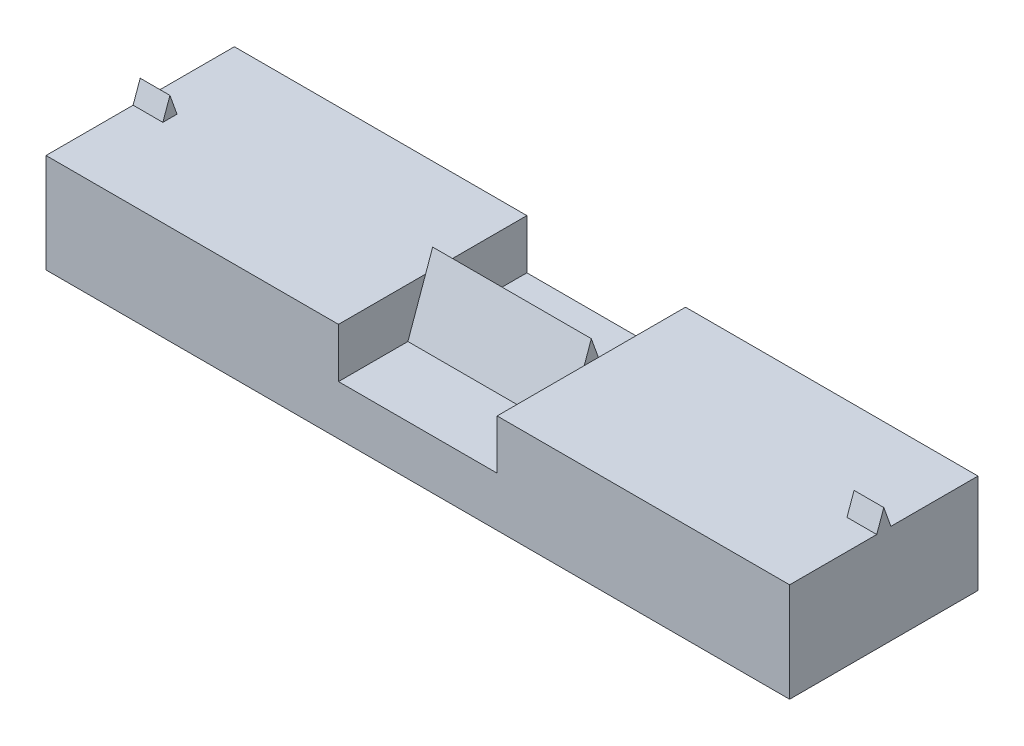
ISO-10303-21;
HEADER;
FILE_DESCRIPTION(('STEP AP214'),'2;1');
FILE_NAME('part.step','',(''),(''),'','','');
FILE_SCHEMA(('AUTOMOTIVE_DESIGN { 1 0 10303 214 1 1 1 1 }'));
ENDSEC;
DATA;
#1=APPLICATION_CONTEXT('core data for automotive mechanical design processes');
#2=APPLICATION_PROTOCOL_DEFINITION('international standard','automotive_design',2000,#1);
#3=PRODUCT_CONTEXT('',#1,'mechanical');
#4=PRODUCT('Part','Part','',(#3));
#5=PRODUCT_RELATED_PRODUCT_CATEGORY('part','',(#4));
#6=PRODUCT_DEFINITION_FORMATION('','',#4);
#7=PRODUCT_DEFINITION_CONTEXT('part definition',#1,'design');
#8=PRODUCT_DEFINITION('design','',#6,#7);
#9=PRODUCT_DEFINITION_SHAPE('','',#8);
#10=(LENGTH_UNIT() NAMED_UNIT(*) SI_UNIT(.MILLI.,.METRE.));
#11=(NAMED_UNIT(*) PLANE_ANGLE_UNIT() SI_UNIT($,.RADIAN.));
#12=(NAMED_UNIT(*) SI_UNIT($,.STERADIAN.) SOLID_ANGLE_UNIT());
#13=UNCERTAINTY_MEASURE_WITH_UNIT(LENGTH_MEASURE(1.E-05),#10,'distance_accuracy_value','');
#14=(GEOMETRIC_REPRESENTATION_CONTEXT(3) GLOBAL_UNCERTAINTY_ASSIGNED_CONTEXT((#13)) GLOBAL_UNIT_ASSIGNED_CONTEXT((#10,
#11,#12)) REPRESENTATION_CONTEXT('',''));
#15=CARTESIAN_POINT('',(0.,0.,0.));
#16=DIRECTION('',(0.,0.,1.));
#17=DIRECTION('',(1.,0.,0.));
#18=AXIS2_PLACEMENT_3D('',#15,#16,#17);
#19=CARTESIAN_POINT('',(37.5,-5.,-2.5));
#20=DIRECTION('',(0.,0.336336396998156,-0.941741911594837));
#21=DIRECTION('',(0.,0.941741911594837,0.336336396998156));
#22=AXIS2_PLACEMENT_3D('',#19,#20,#21);
#23=PLANE('',#22);
#24=DIRECTION('',(-1.,0.,0.));
#25=VECTOR('',#24,1.);
#26=CARTESIAN_POINT('',(37.5,2.,0.));
#27=LINE('',#26,#25);
#28=CARTESIAN_POINT('',(-34.5,2.,0.));
#29=VERTEX_POINT('',#28);
#30=CARTESIAN_POINT('',(-37.5,2.,0.));
#31=VERTEX_POINT('',#30);
#32=EDGE_CURVE('E315',#29,#31,#27,.T.);
#33=ORIENTED_EDGE('',*,*,#32,.F.);
#34=DIRECTION('',(0.,-0.941741911594837,-0.336336396998156));
#35=VECTOR('',#34,1.);
#36=CARTESIAN_POINT('',(-34.5,-5.,-2.5));
#37=LINE('',#36,#35);
#38=CARTESIAN_POINT('',(-34.5,0.,-0.714285714285714));
#39=VERTEX_POINT('',#38);
#40=EDGE_CURVE('E327',#29,#39,#37,.T.);
#41=ORIENTED_EDGE('',*,*,#40,.T.);
#42=DIRECTION('',(1.,0.,0.));
#43=VECTOR('',#42,1.);
#44=CARTESIAN_POINT('',(0.,0.,-0.714285714285713));
#45=LINE('',#44,#43);
#46=CARTESIAN_POINT('',(-37.5,0.,-0.714285714285714));
#47=VERTEX_POINT('',#46);
#48=EDGE_CURVE('E197',#47,#39,#45,.T.);
#49=ORIENTED_EDGE('',*,*,#48,.F.);
#50=DIRECTION('',(0.,-0.941741911594837,-0.336336396998156));
#51=VECTOR('',#50,1.);
#52=CARTESIAN_POINT('',(-37.5,-5.,-2.5));
#53=LINE('',#52,#51);
#54=EDGE_CURVE('E321',#31,#47,#53,.T.);
#55=ORIENTED_EDGE('',*,*,#54,.F.);
#56=EDGE_LOOP('',(#33,#41,#49,#55));
#57=FACE_BOUND('',#56,.T.);
#58=ADVANCED_FACE('F32',(#57),#23,.T.);
#59=DIRECTION('',(0.,-0.941741911594837,-0.336336396998156));
#60=VECTOR('',#59,1.);
#61=CARTESIAN_POINT('',(-8.,-1.19909502262443,-1.14253393665158));
#62=LINE('',#61,#60);
#63=CARTESIAN_POINT('',(-8.,0.,-0.714285714285714));
#64=VERTEX_POINT('',#63);
#65=CARTESIAN_POINT('',(-8.,-5.,-2.5));
#66=VERTEX_POINT('',#65);
#67=EDGE_CURVE('E303',#64,#66,#62,.T.);
#68=ORIENTED_EDGE('',*,*,#67,.F.);
#69=DIRECTION('',(0.,0.941741911594837,0.336336396998156));
#70=VECTOR('',#69,1.);
#71=CARTESIAN_POINT('',(-8.,-5.,-2.5));
#72=LINE('',#71,#70);
#73=CARTESIAN_POINT('',(-8.,2.,0.));
#74=VERTEX_POINT('',#73);
#75=EDGE_CURVE('E185',#64,#74,#72,.T.);
#76=ORIENTED_EDGE('',*,*,#75,.T.);
#77=CARTESIAN_POINT('',(8.,2.,0.));
#78=VERTEX_POINT('',#77);
#79=EDGE_CURVE('E184',#78,#74,#27,.T.);
#80=ORIENTED_EDGE('',*,*,#79,.F.);
#81=DIRECTION('',(0.,-0.941741911594837,-0.336336396998156));
#82=VECTOR('',#81,1.);
#83=CARTESIAN_POINT('',(8.,-5.,-2.5));
#84=LINE('',#83,#82);
#85=CARTESIAN_POINT('',(8.,0.,-0.714285714285714));
#86=VERTEX_POINT('',#85);
#87=EDGE_CURVE('E166',#78,#86,#84,.T.);
#88=ORIENTED_EDGE('',*,*,#87,.T.);
#89=DIRECTION('',(0.,0.941741911594837,0.336336396998156));
#90=VECTOR('',#89,1.);
#91=CARTESIAN_POINT('',(8.,-1.19909502262443,-1.14253393665158));
#92=LINE('',#91,#90);
#93=CARTESIAN_POINT('',(8.,-5.,-2.5));
#94=VERTEX_POINT('',#93);
#95=EDGE_CURVE('E180',#94,#86,#92,.T.);
#96=ORIENTED_EDGE('',*,*,#95,.F.);
#97=DIRECTION('',(1.,0.,0.));
#98=VECTOR('',#97,1.);
#99=CARTESIAN_POINT('',(0.,-5.,-2.5));
#100=LINE('',#99,#98);
#101=EDGE_CURVE('E262',#66,#94,#100,.T.);
#102=ORIENTED_EDGE('',*,*,#101,.F.);
#103=EDGE_LOOP('',(#68,#76,#80,#88,#96,#102));
#104=FACE_BOUND('',#103,.T.);
#105=ADVANCED_FACE('F179',(#104),#23,.T.);
#106=DIRECTION('',(1.,0.,0.));
#107=VECTOR('',#106,1.);
#108=CARTESIAN_POINT('',(0.,0.,-0.714285714285713));
#109=LINE('',#108,#107);
#110=CARTESIAN_POINT('',(34.5,0.,-0.714285714285714));
#111=VERTEX_POINT('',#110);
#112=CARTESIAN_POINT('',(37.5,0.,-0.714285714285714));
#113=VERTEX_POINT('',#112);
#114=EDGE_CURVE('E196',#111,#113,#109,.T.);
#115=ORIENTED_EDGE('',*,*,#114,.F.);
#116=DIRECTION('',(0.,0.941741911594837,0.336336396998156));
#117=VECTOR('',#116,1.);
#118=CARTESIAN_POINT('',(34.5,-5.,-2.5));
#119=LINE('',#118,#117);
#120=CARTESIAN_POINT('',(34.5,2.,0.));
#121=VERTEX_POINT('',#120);
#122=EDGE_CURVE('E186',#111,#121,#119,.T.);
#123=ORIENTED_EDGE('',*,*,#122,.T.);
#124=CARTESIAN_POINT('',(37.5,2.,0.));
#125=VERTEX_POINT('',#124);
#126=EDGE_CURVE('E277',#125,#121,#27,.T.);
#127=ORIENTED_EDGE('',*,*,#126,.F.);
#128=DIRECTION('',(0.,-0.941741911594837,-0.336336396998156));
#129=VECTOR('',#128,1.);
#130=CARTESIAN_POINT('',(37.5,-5.,-2.5));
#131=LINE('',#130,#129);
#132=EDGE_CURVE('E316',#125,#113,#131,.T.);
#133=ORIENTED_EDGE('',*,*,#132,.T.);
#134=EDGE_LOOP('',(#115,#123,#127,#133));
#135=FACE_BOUND('',#134,.T.);
#136=ADVANCED_FACE('F339',(#135),#23,.T.);
#137=CARTESIAN_POINT('',(37.5,2.,0.));
#138=DIRECTION('',(0.,0.336336396998156,0.941741911594837));
#139=DIRECTION('',(0.,-0.941741911594837,0.336336396998156));
#140=AXIS2_PLACEMENT_3D('',#137,#138,#139);
#141=PLANE('',#140);
#142=DIRECTION('',(-1.,0.,0.));
#143=VECTOR('',#142,1.);
#144=CARTESIAN_POINT('',(0.,0.,0.714285714285714));
#145=LINE('',#144,#143);
#146=CARTESIAN_POINT('',(-34.5,0.,0.714285714285714));
#147=VERTEX_POINT('',#146);
#148=CARTESIAN_POINT('',(-37.5,0.,0.714285714285714));
#149=VERTEX_POINT('',#148);
#150=EDGE_CURVE('E276',#147,#149,#145,.T.);
#151=ORIENTED_EDGE('',*,*,#150,.F.);
#152=DIRECTION('',(0.,0.941741911594837,-0.336336396998156));
#153=VECTOR('',#152,1.);
#154=CARTESIAN_POINT('',(-34.5,2.,0.));
#155=LINE('',#154,#153);
#156=EDGE_CURVE('E11',#147,#29,#155,.T.);
#157=ORIENTED_EDGE('',*,*,#156,.T.);
#158=ORIENTED_EDGE('',*,*,#32,.T.);
#159=DIRECTION('',(0.,0.941741911594837,-0.336336396998156));
#160=VECTOR('',#159,1.);
#161=CARTESIAN_POINT('',(-37.5,2.,0.));
#162=LINE('',#161,#160);
#163=EDGE_CURVE('E324',#149,#31,#162,.T.);
#164=ORIENTED_EDGE('',*,*,#163,.F.);
#165=EDGE_LOOP('',(#151,#157,#158,#164));
#166=FACE_BOUND('',#165,.T.);
#167=ADVANCED_FACE('F366',(#166),#141,.T.);
#168=ORIENTED_EDGE('',*,*,#79,.T.);
#169=DIRECTION('',(0.,-0.941741911594837,0.336336396998156));
#170=VECTOR('',#169,1.);
#171=CARTESIAN_POINT('',(-8.,2.,0.));
#172=LINE('',#171,#170);
#173=CARTESIAN_POINT('',(-8.,0.,0.714285714285714));
#174=VERTEX_POINT('',#173);
#175=EDGE_CURVE('E40',#74,#174,#172,.T.);
#176=ORIENTED_EDGE('',*,*,#175,.T.);
#177=DIRECTION('',(0.,0.941741911594837,-0.336336396998156));
#178=VECTOR('',#177,1.);
#179=CARTESIAN_POINT('',(-8.,-7.21719457013575,3.29185520361991));
#180=LINE('',#179,#178);
#181=CARTESIAN_POINT('',(-8.,-5.,2.5));
#182=VERTEX_POINT('',#181);
#183=EDGE_CURVE('E55',#182,#174,#180,.T.);
#184=ORIENTED_EDGE('',*,*,#183,.F.);
#185=DIRECTION('',(-1.,0.,0.));
#186=VECTOR('',#185,1.);
#187=CARTESIAN_POINT('',(0.,-5.,2.5));
#188=LINE('',#187,#186);
#189=CARTESIAN_POINT('',(8.,-5.,2.5));
#190=VERTEX_POINT('',#189);
#191=EDGE_CURVE('E252',#190,#182,#188,.T.);
#192=ORIENTED_EDGE('',*,*,#191,.F.);
#193=DIRECTION('',(0.,-0.941741911594837,0.336336396998156));
#194=VECTOR('',#193,1.);
#195=CARTESIAN_POINT('',(8.,-7.21719457013575,3.29185520361991));
#196=LINE('',#195,#194);
#197=CARTESIAN_POINT('',(8.,0.,0.714285714285713));
#198=VERTEX_POINT('',#197);
#199=EDGE_CURVE('E309',#198,#190,#196,.T.);
#200=ORIENTED_EDGE('',*,*,#199,.F.);
#201=DIRECTION('',(0.,0.941741911594837,-0.336336396998156));
#202=VECTOR('',#201,1.);
#203=CARTESIAN_POINT('',(8.,2.,0.));
#204=LINE('',#203,#202);
#205=EDGE_CURVE('E168',#198,#78,#204,.T.);
#206=ORIENTED_EDGE('',*,*,#205,.T.);
#207=EDGE_LOOP('',(#168,#176,#184,#192,#200,#206));
#208=FACE_BOUND('',#207,.T.);
#209=ADVANCED_FACE('F267',(#208),#141,.T.);
#210=ORIENTED_EDGE('',*,*,#126,.T.);
#211=DIRECTION('',(0.,-0.941741911594837,0.336336396998156));
#212=VECTOR('',#211,1.);
#213=CARTESIAN_POINT('',(34.5,2.,0.));
#214=LINE('',#213,#212);
#215=CARTESIAN_POINT('',(34.5,0.,0.714285714285714));
#216=VERTEX_POINT('',#215);
#217=EDGE_CURVE('E264',#121,#216,#214,.T.);
#218=ORIENTED_EDGE('',*,*,#217,.T.);
#219=DIRECTION('',(-1.,0.,0.));
#220=VECTOR('',#219,1.);
#221=CARTESIAN_POINT('',(0.,0.,0.714285714285714));
#222=LINE('',#221,#220);
#223=CARTESIAN_POINT('',(37.5,0.,0.714285714285714));
#224=VERTEX_POINT('',#223);
#225=EDGE_CURVE('E306',#224,#216,#222,.T.);
#226=ORIENTED_EDGE('',*,*,#225,.F.);
#227=DIRECTION('',(0.,0.941741911594837,-0.336336396998156));
#228=VECTOR('',#227,1.);
#229=CARTESIAN_POINT('',(37.5,2.,0.));
#230=LINE('',#229,#228);
#231=EDGE_CURVE('E319',#224,#125,#230,.T.);
#232=ORIENTED_EDGE('',*,*,#231,.T.);
#233=EDGE_LOOP('',(#210,#218,#226,#232));
#234=FACE_BOUND('',#233,.T.);
#235=ADVANCED_FACE('F395',(#234),#141,.T.);
#236=CARTESIAN_POINT('',(8.,-5.,9.5));
#237=DIRECTION('',(1.,0.,0.));
#238=DIRECTION('',(0.,0.,-1.));
#239=AXIS2_PLACEMENT_3D('',#236,#237,#238);
#240=PLANE('',#239);
#241=DIRECTION('',(0.,0.,-1.));
#242=VECTOR('',#241,1.);
#243=CARTESIAN_POINT('',(8.,-5.,9.5));
#244=LINE('',#243,#242);
#245=CARTESIAN_POINT('',(8.,-5.,-9.5));
#246=VERTEX_POINT('',#245);
#247=EDGE_CURVE('E195',#94,#246,#244,.T.);
#248=ORIENTED_EDGE('',*,*,#247,.F.);
#249=ORIENTED_EDGE('',*,*,#95,.T.);
#250=DIRECTION('',(0.,0.,-1.));
#251=VECTOR('',#250,1.);
#252=CARTESIAN_POINT('',(8.,0.,9.5));
#253=LINE('',#252,#251);
#254=CARTESIAN_POINT('',(8.,0.,-9.5));
#255=VERTEX_POINT('',#254);
#256=EDGE_CURVE('E193',#86,#255,#253,.T.);
#257=ORIENTED_EDGE('',*,*,#256,.T.);
#258=DIRECTION('',(0.,1.,0.));
#259=VECTOR('',#258,1.);
#260=CARTESIAN_POINT('',(8.,-5.,-9.5));
#261=LINE('',#260,#259);
#262=EDGE_CURVE('E222',#246,#255,#261,.T.);
#263=ORIENTED_EDGE('',*,*,#262,.F.);
#264=EDGE_LOOP('',(#248,#249,#257,#263));
#265=FACE_BOUND('',#264,.T.);
#266=ADVANCED_FACE('F191',(#265),#240,.F.);
#267=CARTESIAN_POINT('',(-8.,-5.,9.5));
#268=DIRECTION('',(-1.,0.,0.));
#269=DIRECTION('',(0.,0.,1.));
#270=AXIS2_PLACEMENT_3D('',#267,#268,#269);
#271=PLANE('',#270);
#272=DIRECTION('',(0.,0.,1.));
#273=VECTOR('',#272,1.);
#274=CARTESIAN_POINT('',(-8.,0.,9.5));
#275=LINE('',#274,#273);
#276=CARTESIAN_POINT('',(-8.,0.,-9.5));
#277=VERTEX_POINT('',#276);
#278=EDGE_CURVE('E211',#277,#64,#275,.T.);
#279=ORIENTED_EDGE('',*,*,#278,.T.);
#280=ORIENTED_EDGE('',*,*,#67,.T.);
#281=DIRECTION('',(0.,0.,1.));
#282=VECTOR('',#281,1.);
#283=CARTESIAN_POINT('',(-8.,-5.,9.5));
#284=LINE('',#283,#282);
#285=CARTESIAN_POINT('',(-8.,-5.,-9.5));
#286=VERTEX_POINT('',#285);
#287=EDGE_CURVE('E293',#286,#66,#284,.T.);
#288=ORIENTED_EDGE('',*,*,#287,.F.);
#289=DIRECTION('',(0.,1.,0.));
#290=VECTOR('',#289,1.);
#291=CARTESIAN_POINT('',(-8.,-5.,-9.5));
#292=LINE('',#291,#290);
#293=EDGE_CURVE('E220',#286,#277,#292,.T.);
#294=ORIENTED_EDGE('',*,*,#293,.T.);
#295=EDGE_LOOP('',(#279,#280,#288,#294));
#296=FACE_BOUND('',#295,.T.);
#297=ADVANCED_FACE('F354',(#296),#271,.F.);
#298=CARTESIAN_POINT('',(0.,-5.,0.));
#299=DIRECTION('',(0.,-1.,0.));
#300=DIRECTION('',(0.,0.,-1.));
#301=AXIS2_PLACEMENT_3D('',#298,#299,#300);
#302=PLANE('',#301);
#303=ORIENTED_EDGE('',*,*,#287,.T.);
#304=ORIENTED_EDGE('',*,*,#101,.T.);
#305=ORIENTED_EDGE('',*,*,#247,.T.);
#306=DIRECTION('',(-1.,0.,0.));
#307=VECTOR('',#306,1.);
#308=CARTESIAN_POINT('',(-8.,-5.,-9.5));
#309=LINE('',#308,#307);
#310=EDGE_CURVE('E297',#246,#286,#309,.T.);
#311=ORIENTED_EDGE('',*,*,#310,.T.);
#312=EDGE_LOOP('',(#303,#304,#305,#311));
#313=FACE_BOUND('',#312,.T.);
#314=ADVANCED_FACE('F352',(#313),#302,.F.);
#315=CARTESIAN_POINT('',(0.,0.,0.));
#316=DIRECTION('',(0.,-1.,0.));
#317=DIRECTION('',(0.,0.,-1.));
#318=AXIS2_PLACEMENT_3D('',#315,#316,#317);
#319=PLANE('',#318);
#320=DIRECTION('',(1.,0.,0.));
#321=VECTOR('',#320,1.);
#322=CARTESIAN_POINT('',(-37.5,0.,9.5));
#323=LINE('',#322,#321);
#324=CARTESIAN_POINT('',(8.,0.,9.5));
#325=VERTEX_POINT('',#324);
#326=CARTESIAN_POINT('',(37.5,0.,9.5));
#327=VERTEX_POINT('',#326);
#328=EDGE_CURVE('E247',#325,#327,#323,.T.);
#329=ORIENTED_EDGE('',*,*,#328,.T.);
#330=DIRECTION('',(0.,0.,-1.));
#331=VECTOR('',#330,1.);
#332=CARTESIAN_POINT('',(37.5,0.,9.5));
#333=LINE('',#332,#331);
#334=EDGE_CURVE('E238',#327,#224,#333,.T.);
#335=ORIENTED_EDGE('',*,*,#334,.T.);
#336=ORIENTED_EDGE('',*,*,#225,.T.);
#337=DIRECTION('',(0.,0.,-1.));
#338=VECTOR('',#337,1.);
#339=CARTESIAN_POINT('',(34.5,0.,-9.5));
#340=LINE('',#339,#338);
#341=EDGE_CURVE('E173',#216,#111,#340,.T.);
#342=ORIENTED_EDGE('',*,*,#341,.T.);
#343=ORIENTED_EDGE('',*,*,#114,.T.);
#344=CARTESIAN_POINT('',(37.5,0.,-9.5));
#345=VERTEX_POINT('',#344);
#346=EDGE_CURVE('E216',#113,#345,#333,.T.);
#347=ORIENTED_EDGE('',*,*,#346,.T.);
#348=DIRECTION('',(-1.,0.,0.));
#349=VECTOR('',#348,1.);
#350=CARTESIAN_POINT('',(-37.5,0.,-9.5));
#351=LINE('',#350,#349);
#352=EDGE_CURVE('E201',#345,#255,#351,.T.);
#353=ORIENTED_EDGE('',*,*,#352,.T.);
#354=ORIENTED_EDGE('',*,*,#256,.F.);
#355=DIRECTION('',(0.,0.,1.));
#356=VECTOR('',#355,1.);
#357=CARTESIAN_POINT('',(8.,0.,-9.5));
#358=LINE('',#357,#356);
#359=EDGE_CURVE('E163',#86,#198,#358,.T.);
#360=ORIENTED_EDGE('',*,*,#359,.T.);
#361=EDGE_CURVE('E202',#325,#198,#253,.T.);
#362=ORIENTED_EDGE('',*,*,#361,.F.);
#363=EDGE_LOOP('',(#329,#335,#336,#342,#343,#347,#353,#354,#360,#362));
#364=FACE_BOUND('',#363,.T.);
#365=ADVANCED_FACE('F199',(#364),#319,.F.);
#366=CARTESIAN_POINT('',(37.5,-10.,9.5));
#367=DIRECTION('',(1.,0.,0.));
#368=DIRECTION('',(0.,0.,-1.));
#369=AXIS2_PLACEMENT_3D('',#366,#367,#368);
#370=PLANE('',#369);
#371=ORIENTED_EDGE('',*,*,#346,.F.);
#372=ORIENTED_EDGE('',*,*,#132,.F.);
#373=ORIENTED_EDGE('',*,*,#231,.F.);
#374=ORIENTED_EDGE('',*,*,#334,.F.);
#375=DIRECTION('',(0.,1.,0.));
#376=VECTOR('',#375,1.);
#377=CARTESIAN_POINT('',(37.5,-10.,9.5));
#378=LINE('',#377,#376);
#379=CARTESIAN_POINT('',(37.5,-10.,9.5));
#380=VERTEX_POINT('',#379);
#381=EDGE_CURVE('E249',#380,#327,#378,.T.);
#382=ORIENTED_EDGE('',*,*,#381,.F.);
#383=DIRECTION('',(0.,0.,-1.));
#384=VECTOR('',#383,1.);
#385=CARTESIAN_POINT('',(37.5,-10.,9.5));
#386=LINE('',#385,#384);
#387=CARTESIAN_POINT('',(37.5,-10.,-9.5));
#388=VERTEX_POINT('',#387);
#389=EDGE_CURVE('E224',#380,#388,#386,.T.);
#390=ORIENTED_EDGE('',*,*,#389,.T.);
#391=DIRECTION('',(0.,1.,0.));
#392=VECTOR('',#391,1.);
#393=CARTESIAN_POINT('',(37.5,-10.,-9.5));
#394=LINE('',#393,#392);
#395=EDGE_CURVE('E237',#388,#345,#394,.T.);
#396=ORIENTED_EDGE('',*,*,#395,.T.);
#397=EDGE_LOOP('',(#371,#372,#373,#374,#382,#390,#396));
#398=FACE_BOUND('',#397,.T.);
#399=ADVANCED_FACE('F34',(#398),#370,.T.);
#400=CARTESIAN_POINT('',(-37.5,-10.,9.5));
#401=DIRECTION('',(0.,0.,1.));
#402=DIRECTION('',(1.,0.,0.));
#403=AXIS2_PLACEMENT_3D('',#400,#401,#402);
#404=PLANE('',#403);
#405=DIRECTION('',(0.,1.,0.));
#406=VECTOR('',#405,1.);
#407=CARTESIAN_POINT('',(8.,-5.,9.5));
#408=LINE('',#407,#406);
#409=CARTESIAN_POINT('',(8.,-5.,9.5));
#410=VERTEX_POINT('',#409);
#411=EDGE_CURVE('E214',#410,#325,#408,.T.);
#412=ORIENTED_EDGE('',*,*,#411,.F.);
#413=DIRECTION('',(1.,0.,0.));
#414=VECTOR('',#413,1.);
#415=CARTESIAN_POINT('',(-8.,-5.,9.5));
#416=LINE('',#415,#414);
#417=CARTESIAN_POINT('',(-8.,-5.,9.5));
#418=VERTEX_POINT('',#417);
#419=EDGE_CURVE('E209',#418,#410,#416,.T.);
#420=ORIENTED_EDGE('',*,*,#419,.F.);
#421=DIRECTION('',(0.,1.,0.));
#422=VECTOR('',#421,1.);
#423=CARTESIAN_POINT('',(-8.,-5.,9.5));
#424=LINE('',#423,#422);
#425=CARTESIAN_POINT('',(-8.,0.,9.5));
#426=VERTEX_POINT('',#425);
#427=EDGE_CURVE('E217',#418,#426,#424,.T.);
#428=ORIENTED_EDGE('',*,*,#427,.T.);
#429=CARTESIAN_POINT('',(-37.5,0.,9.5));
#430=VERTEX_POINT('',#429);
#431=EDGE_CURVE('E228',#430,#426,#323,.T.);
#432=ORIENTED_EDGE('',*,*,#431,.F.);
#433=DIRECTION('',(0.,1.,0.));
#434=VECTOR('',#433,1.);
#435=CARTESIAN_POINT('',(-37.5,-10.,9.5));
#436=LINE('',#435,#434);
#437=CARTESIAN_POINT('',(-37.5,-10.,9.5));
#438=VERTEX_POINT('',#437);
#439=EDGE_CURVE('E253',#438,#430,#436,.T.);
#440=ORIENTED_EDGE('',*,*,#439,.F.);
#441=DIRECTION('',(1.,0.,0.));
#442=VECTOR('',#441,1.);
#443=CARTESIAN_POINT('',(-37.5,-10.,9.5));
#444=LINE('',#443,#442);
#445=EDGE_CURVE('E234',#438,#380,#444,.T.);
#446=ORIENTED_EDGE('',*,*,#445,.T.);
#447=ORIENTED_EDGE('',*,*,#381,.T.);
#448=ORIENTED_EDGE('',*,*,#328,.F.);
#449=EDGE_LOOP('',(#412,#420,#428,#432,#440,#446,#447,#448));
#450=FACE_BOUND('',#449,.T.);
#451=ADVANCED_FACE('F287',(#450),#404,.T.);
#452=CARTESIAN_POINT('',(-37.5,-10.,9.5));
#453=DIRECTION('',(-1.,0.,0.));
#454=DIRECTION('',(0.,0.,1.));
#455=AXIS2_PLACEMENT_3D('',#452,#453,#454);
#456=PLANE('',#455);
#457=ORIENTED_EDGE('',*,*,#54,.T.);
#458=DIRECTION('',(0.,0.,1.));
#459=VECTOR('',#458,1.);
#460=CARTESIAN_POINT('',(-37.5,0.,9.5));
#461=LINE('',#460,#459);
#462=CARTESIAN_POINT('',(-37.5,0.,-9.5));
#463=VERTEX_POINT('',#462);
#464=EDGE_CURVE('E244',#463,#47,#461,.T.);
#465=ORIENTED_EDGE('',*,*,#464,.F.);
#466=DIRECTION('',(0.,1.,0.));
#467=VECTOR('',#466,1.);
#468=CARTESIAN_POINT('',(-37.5,-10.,-9.5));
#469=LINE('',#468,#467);
#470=CARTESIAN_POINT('',(-37.5,-10.,-9.5));
#471=VERTEX_POINT('',#470);
#472=EDGE_CURVE('E256',#471,#463,#469,.T.);
#473=ORIENTED_EDGE('',*,*,#472,.F.);
#474=DIRECTION('',(0.,0.,1.));
#475=VECTOR('',#474,1.);
#476=CARTESIAN_POINT('',(-37.5,-10.,9.5));
#477=LINE('',#476,#475);
#478=EDGE_CURVE('E231',#471,#438,#477,.T.);
#479=ORIENTED_EDGE('',*,*,#478,.T.);
#480=ORIENTED_EDGE('',*,*,#439,.T.);
#481=EDGE_CURVE('E243',#149,#430,#461,.T.);
#482=ORIENTED_EDGE('',*,*,#481,.F.);
#483=ORIENTED_EDGE('',*,*,#163,.T.);
#484=EDGE_LOOP('',(#457,#465,#473,#479,#480,#482,#483));
#485=FACE_BOUND('',#484,.T.);
#486=ADVANCED_FACE('F358',(#485),#456,.T.);
#487=CARTESIAN_POINT('',(-37.5,-10.,-9.5));
#488=DIRECTION('',(0.,0.,-1.));
#489=DIRECTION('',(-1.,0.,0.));
#490=AXIS2_PLACEMENT_3D('',#487,#488,#489);
#491=PLANE('',#490);
#492=ORIENTED_EDGE('',*,*,#262,.T.);
#493=ORIENTED_EDGE('',*,*,#352,.F.);
#494=ORIENTED_EDGE('',*,*,#395,.F.);
#495=DIRECTION('',(-1.,0.,0.));
#496=VECTOR('',#495,1.);
#497=CARTESIAN_POINT('',(-37.5,-10.,-9.5));
#498=LINE('',#497,#496);
#499=EDGE_CURVE('E227',#388,#471,#498,.T.);
#500=ORIENTED_EDGE('',*,*,#499,.T.);
#501=ORIENTED_EDGE('',*,*,#472,.T.);
#502=EDGE_CURVE('E241',#277,#463,#351,.T.);
#503=ORIENTED_EDGE('',*,*,#502,.F.);
#504=ORIENTED_EDGE('',*,*,#293,.F.);
#505=ORIENTED_EDGE('',*,*,#310,.F.);
#506=EDGE_LOOP('',(#492,#493,#494,#500,#501,#503,#504,#505));
#507=FACE_BOUND('',#506,.T.);
#508=ADVANCED_FACE('F348',(#507),#491,.T.);
#509=CARTESIAN_POINT('',(0.,-10.,0.));
#510=DIRECTION('',(0.,-1.,0.));
#511=DIRECTION('',(0.,0.,-1.));
#512=AXIS2_PLACEMENT_3D('',#509,#510,#511);
#513=PLANE('',#512);
#514=ORIENTED_EDGE('',*,*,#389,.F.);
#515=ORIENTED_EDGE('',*,*,#445,.F.);
#516=ORIENTED_EDGE('',*,*,#478,.F.);
#517=ORIENTED_EDGE('',*,*,#499,.F.);
#518=EDGE_LOOP('',(#514,#515,#516,#517));
#519=FACE_BOUND('',#518,.T.);
#520=ADVANCED_FACE('F370',(#519),#513,.T.);
#521=EDGE_CURVE('E205',#174,#426,#275,.T.);
#522=ORIENTED_EDGE('',*,*,#521,.F.);
#523=DIRECTION('',(0.,0.,-1.));
#524=VECTOR('',#523,1.);
#525=CARTESIAN_POINT('',(-8.,0.,-9.5));
#526=LINE('',#525,#524);
#527=EDGE_CURVE('E282',#174,#64,#526,.T.);
#528=ORIENTED_EDGE('',*,*,#527,.T.);
#529=ORIENTED_EDGE('',*,*,#278,.F.);
#530=ORIENTED_EDGE('',*,*,#502,.T.);
#531=ORIENTED_EDGE('',*,*,#464,.T.);
#532=ORIENTED_EDGE('',*,*,#48,.T.);
#533=DIRECTION('',(0.,0.,1.));
#534=VECTOR('',#533,1.);
#535=CARTESIAN_POINT('',(-34.5,0.,-9.5));
#536=LINE('',#535,#534);
#537=EDGE_CURVE('E47',#39,#147,#536,.T.);
#538=ORIENTED_EDGE('',*,*,#537,.T.);
#539=ORIENTED_EDGE('',*,*,#150,.T.);
#540=ORIENTED_EDGE('',*,*,#481,.T.);
#541=ORIENTED_EDGE('',*,*,#431,.T.);
#542=EDGE_LOOP('',(#522,#528,#529,#530,#531,#532,#538,#539,#540,#541));
#543=FACE_BOUND('',#542,.T.);
#544=ADVANCED_FACE('F280',(#543),#319,.F.);
#545=ORIENTED_EDGE('',*,*,#361,.T.);
#546=ORIENTED_EDGE('',*,*,#199,.T.);
#547=EDGE_CURVE('E300',#410,#190,#244,.T.);
#548=ORIENTED_EDGE('',*,*,#547,.F.);
#549=ORIENTED_EDGE('',*,*,#411,.T.);
#550=EDGE_LOOP('',(#545,#546,#548,#549));
#551=FACE_BOUND('',#550,.T.);
#552=ADVANCED_FACE('F373',(#551),#240,.F.);
#553=EDGE_CURVE('E275',#182,#418,#284,.T.);
#554=ORIENTED_EDGE('',*,*,#553,.F.);
#555=ORIENTED_EDGE('',*,*,#183,.T.);
#556=ORIENTED_EDGE('',*,*,#521,.T.);
#557=ORIENTED_EDGE('',*,*,#427,.F.);
#558=EDGE_LOOP('',(#554,#555,#556,#557));
#559=FACE_BOUND('',#558,.T.);
#560=ADVANCED_FACE('F273',(#559),#271,.F.);
#561=ORIENTED_EDGE('',*,*,#547,.T.);
#562=ORIENTED_EDGE('',*,*,#191,.T.);
#563=ORIENTED_EDGE('',*,*,#553,.T.);
#564=ORIENTED_EDGE('',*,*,#419,.T.);
#565=EDGE_LOOP('',(#561,#562,#563,#564));
#566=FACE_BOUND('',#565,.T.);
#567=ADVANCED_FACE('F374',(#566),#302,.F.);
#568=CARTESIAN_POINT('',(8.,2.,-9.5));
#569=DIRECTION('',(1.,0.,0.));
#570=DIRECTION('',(0.,0.,-1.));
#571=AXIS2_PLACEMENT_3D('',#568,#569,#570);
#572=PLANE('',#571);
#573=ORIENTED_EDGE('',*,*,#205,.F.);
#574=ORIENTED_EDGE('',*,*,#359,.F.);
#575=ORIENTED_EDGE('',*,*,#87,.F.);
#576=EDGE_LOOP('',(#573,#574,#575));
#577=FACE_BOUND('',#576,.T.);
#578=ADVANCED_FACE('F165',(#577),#572,.T.);
#579=CARTESIAN_POINT('',(34.5,2.,-9.5));
#580=DIRECTION('',(-1.,0.,0.));
#581=DIRECTION('',(0.,0.,1.));
#582=AXIS2_PLACEMENT_3D('',#579,#580,#581);
#583=PLANE('',#582);
#584=ORIENTED_EDGE('',*,*,#341,.F.);
#585=ORIENTED_EDGE('',*,*,#217,.F.);
#586=ORIENTED_EDGE('',*,*,#122,.F.);
#587=EDGE_LOOP('',(#584,#585,#586));
#588=FACE_BOUND('',#587,.T.);
#589=ADVANCED_FACE('F381',(#588),#583,.T.);
#590=CARTESIAN_POINT('',(-34.5,2.,-9.5));
#591=DIRECTION('',(1.,0.,0.));
#592=DIRECTION('',(0.,0.,-1.));
#593=AXIS2_PLACEMENT_3D('',#590,#591,#592);
#594=PLANE('',#593);
#595=ORIENTED_EDGE('',*,*,#156,.F.);
#596=ORIENTED_EDGE('',*,*,#537,.F.);
#597=ORIENTED_EDGE('',*,*,#40,.F.);
#598=EDGE_LOOP('',(#595,#596,#597));
#599=FACE_BOUND('',#598,.T.);
#600=ADVANCED_FACE('F363',(#599),#594,.T.);
#601=CARTESIAN_POINT('',(-8.,2.,-9.5));
#602=DIRECTION('',(-1.,0.,0.));
#603=DIRECTION('',(0.,0.,1.));
#604=AXIS2_PLACEMENT_3D('',#601,#602,#603);
#605=PLANE('',#604);
#606=ORIENTED_EDGE('',*,*,#527,.F.);
#607=ORIENTED_EDGE('',*,*,#175,.F.);
#608=ORIENTED_EDGE('',*,*,#75,.F.);
#609=EDGE_LOOP('',(#606,#607,#608));
#610=FACE_BOUND('',#609,.T.);
#611=ADVANCED_FACE('F410',(#610),#605,.T.);
#612=CLOSED_SHELL('',(#58,#105,#136,#167,#209,#235,#266,#297,#314,#365,#399,#451,#486,#508,#520,
#544,#552,#560,#567,#578,#589,#600,#611));
#613=MANIFOLD_SOLID_BREP('B2',#612);
#614=ADVANCED_BREP_SHAPE_REPRESENTATION('',(#18,#613),#14);
#615=SHAPE_DEFINITION_REPRESENTATION(#9,#614);
ENDSEC;
END-ISO-10303-21;
